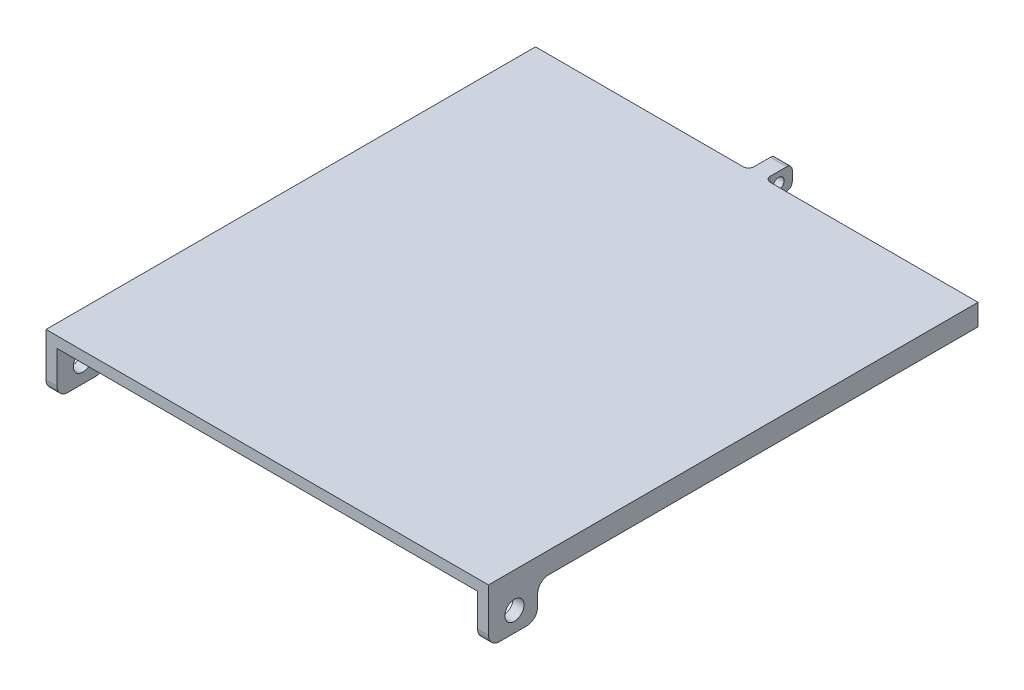
ISO-10303-21;
HEADER;
FILE_DESCRIPTION(('STEP AP214'),'2;1');
FILE_NAME('part.step','',(''),(''),'','','');
FILE_SCHEMA(('AUTOMOTIVE_DESIGN { 1 0 10303 214 1 1 1 1 }'));
ENDSEC;
DATA;
#1=APPLICATION_CONTEXT('core data for automotive mechanical design processes');
#2=APPLICATION_PROTOCOL_DEFINITION('international standard','automotive_design',2000,#1);
#3=PRODUCT_CONTEXT('',#1,'mechanical');
#4=PRODUCT('Part','Part','',(#3));
#5=PRODUCT_RELATED_PRODUCT_CATEGORY('part','',(#4));
#6=PRODUCT_DEFINITION_FORMATION('','',#4);
#7=PRODUCT_DEFINITION_CONTEXT('part definition',#1,'design');
#8=PRODUCT_DEFINITION('design','',#6,#7);
#9=PRODUCT_DEFINITION_SHAPE('','',#8);
#10=(LENGTH_UNIT() NAMED_UNIT(*) SI_UNIT(.MILLI.,.METRE.));
#11=(NAMED_UNIT(*) PLANE_ANGLE_UNIT() SI_UNIT($,.RADIAN.));
#12=(NAMED_UNIT(*) SI_UNIT($,.STERADIAN.) SOLID_ANGLE_UNIT());
#13=UNCERTAINTY_MEASURE_WITH_UNIT(LENGTH_MEASURE(1.E-05),#10,'distance_accuracy_value','');
#14=(GEOMETRIC_REPRESENTATION_CONTEXT(3) GLOBAL_UNCERTAINTY_ASSIGNED_CONTEXT((#13)) GLOBAL_UNIT_ASSIGNED_CONTEXT((#10,
#11,#12)) REPRESENTATION_CONTEXT('',''));
#15=CARTESIAN_POINT('',(0.,0.,0.));
#16=DIRECTION('',(0.,0.,1.));
#17=DIRECTION('',(1.,0.,0.));
#18=AXIS2_PLACEMENT_3D('',#15,#16,#17);
#19=CARTESIAN_POINT('',(32.8584578602391,8.,-94.0886048384759));
#20=DIRECTION('',(0.,0.,1.));
#21=DIRECTION('',(1.,0.,0.));
#22=AXIS2_PLACEMENT_3D('',#19,#20,#21);
#23=PLANE('',#22);
#24=DIRECTION('',(-1.,0.,0.));
#25=VECTOR('',#24,1.);
#26=CARTESIAN_POINT('',(-48.1415421397609,10.,-94.0886048384759));
#27=LINE('',#26,#25);
#28=CARTESIAN_POINT('',(-10.1415421397609,10.,-94.0886048384759));
#29=VERTEX_POINT('',#28);
#30=CARTESIAN_POINT('',(-48.1415421397609,10.,-94.0886048384759));
#31=VERTEX_POINT('',#30);
#32=EDGE_CURVE('E356',#29,#31,#27,.T.);
#33=ORIENTED_EDGE('',*,*,#32,.F.);
#34=DIRECTION('',(0.,1.,0.));
#35=VECTOR('',#34,1.);
#36=CARTESIAN_POINT('',(-10.1415421397609,8.,-94.0886048384759));
#37=LINE('',#36,#35);
#38=CARTESIAN_POINT('',(-10.1415421397609,6.1,-94.0886048384759));
#39=VERTEX_POINT('',#38);
#40=EDGE_CURVE('E53',#29,#39,#37,.F.);
#41=ORIENTED_EDGE('',*,*,#40,.T.);
#42=DIRECTION('',(-1.,0.,0.));
#43=VECTOR('',#42,1.);
#44=CARTESIAN_POINT('',(32.8584578602391,6.1,-94.0886048384759));
#45=LINE('',#44,#43);
#46=CARTESIAN_POINT('',(-48.1415421397609,6.1,-94.0886048384759));
#47=VERTEX_POINT('',#46);
#48=EDGE_CURVE('E317',#39,#47,#45,.T.);
#49=ORIENTED_EDGE('',*,*,#48,.T.);
#50=DIRECTION('',(0.,-1.,0.));
#51=VECTOR('',#50,1.);
#52=CARTESIAN_POINT('',(-48.1415421397609,8.,-94.0886048384759));
#53=LINE('',#52,#51);
#54=EDGE_CURVE('E404',#31,#47,#53,.T.);
#55=ORIENTED_EDGE('',*,*,#54,.F.);
#56=EDGE_LOOP('',(#33,#41,#49,#55));
#57=FACE_BOUND('',#56,.T.);
#58=ADVANCED_FACE('F32',(#57),#23,.F.);
#59=CARTESIAN_POINT('',(0.,8.,0.));
#60=DIRECTION('',(0.,1.,0.));
#61=DIRECTION('',(0.,0.,1.));
#62=AXIS2_PLACEMENT_3D('',#59,#60,#61);
#63=PLANE('',#62);
#64=DIRECTION('',(1.,0.,0.));
#65=VECTOR('',#64,1.);
#66=CARTESIAN_POINT('',(-48.1415421397609,8.,-4.48860483847592));
#67=LINE('',#66,#65);
#68=CARTESIAN_POINT('',(-46.1415421397609,8.,-4.48860483847592));
#69=VERTEX_POINT('',#68);
#70=CARTESIAN_POINT('',(30.8584578602391,8.,-4.48860483847592));
#71=VERTEX_POINT('',#70);
#72=EDGE_CURVE('E347',#69,#71,#67,.T.);
#73=ORIENTED_EDGE('',*,*,#72,.F.);
#74=DIRECTION('',(0.,0.,-1.));
#75=VECTOR('',#74,1.);
#76=CARTESIAN_POINT('',(-46.1415421397609,8.,-4.48860483847592));
#77=LINE('',#76,#75);
#78=CARTESIAN_POINT('',(-46.1415421397609,8.,-92.0886048384759));
#79=VERTEX_POINT('',#78);
#80=EDGE_CURVE('E363',#69,#79,#77,.T.);
#81=ORIENTED_EDGE('',*,*,#80,.T.);
#82=DIRECTION('',(1.,0.,0.));
#83=VECTOR('',#82,1.);
#84=CARTESIAN_POINT('',(-46.1415421397609,8.,-92.0886048384759));
#85=LINE('',#84,#83);
#86=CARTESIAN_POINT('',(30.8584578602391,8.,-92.0886048384759));
#87=VERTEX_POINT('',#86);
#88=EDGE_CURVE('E366',#79,#87,#85,.T.);
#89=ORIENTED_EDGE('',*,*,#88,.T.);
#90=DIRECTION('',(0.,0.,1.));
#91=VECTOR('',#90,1.);
#92=CARTESIAN_POINT('',(30.8584578602391,8.,-92.0886048384759));
#93=LINE('',#92,#91);
#94=EDGE_CURVE('E370',#87,#71,#93,.T.);
#95=ORIENTED_EDGE('',*,*,#94,.T.);
#96=EDGE_LOOP('',(#73,#81,#89,#95));
#97=FACE_BOUND('',#96,.T.);
#98=DIRECTION('',(0.,0.,-1.));
#99=VECTOR('',#98,1.);
#100=CARTESIAN_POINT('',(-42.0415421397609,8.,-13.005302831254));
#101=LINE('',#100,#99);
#102=CARTESIAN_POINT('',(-42.0415421397609,8.,-9.80530283125397));
#103=VERTEX_POINT('',#102);
#104=CARTESIAN_POINT('',(-42.0415421397609,8.,-13.005302831254));
#105=VERTEX_POINT('',#104);
#106=EDGE_CURVE('E296',#103,#105,#101,.T.);
#107=ORIENTED_EDGE('',*,*,#106,.F.);
#108=DIRECTION('',(-1.,0.,0.));
#109=VECTOR('',#108,1.);
#110=CARTESIAN_POINT('',(26.7584578602391,8.,-9.80530283125396));
#111=LINE('',#110,#109);
#112=CARTESIAN_POINT('',(26.7584578602391,8.,-9.80530283125396));
#113=VERTEX_POINT('',#112);
#114=EDGE_CURVE('E407',#103,#113,#111,.F.);
#115=ORIENTED_EDGE('',*,*,#114,.T.);
#116=DIRECTION('',(0.,0.,1.));
#117=VECTOR('',#116,1.);
#118=CARTESIAN_POINT('',(26.7584578602391,8.,-13.005302831254));
#119=LINE('',#118,#117);
#120=CARTESIAN_POINT('',(26.7584578602391,8.,-13.005302831254));
#121=VERTEX_POINT('',#120);
#122=EDGE_CURVE('E279',#121,#113,#119,.T.);
#123=ORIENTED_EDGE('',*,*,#122,.F.);
#124=DIRECTION('',(1.,0.,0.));
#125=VECTOR('',#124,1.);
#126=CARTESIAN_POINT('',(26.7584578602391,8.,-13.005302831254));
#127=LINE('',#126,#125);
#128=EDGE_CURVE('E287',#105,#121,#127,.T.);
#129=ORIENTED_EDGE('',*,*,#128,.F.);
#130=EDGE_LOOP('',(#107,#115,#123,#129));
#131=FACE_BOUND('',#130,.T.);
#132=ADVANCED_FACE('F510',(#97,#131),#63,.F.);
#133=CARTESIAN_POINT('',(0.,0.,0.));
#134=DIRECTION('',(0.,1.,0.));
#135=DIRECTION('',(0.,0.,1.));
#136=AXIS2_PLACEMENT_3D('',#133,#134,#135);
#137=PLANE('',#136);
#138=DIRECTION('',(0.,0.,-1.));
#139=VECTOR('',#138,1.);
#140=CARTESIAN_POINT('',(-46.1415421397609,0.,-13.4886048384759));
#141=LINE('',#140,#139);
#142=CARTESIAN_POINT('',(-46.1415421397609,0.,-6.48860483847592));
#143=VERTEX_POINT('',#142);
#144=CARTESIAN_POINT('',(-46.1415421397609,0.,-11.488604838476));
#145=VERTEX_POINT('',#144);
#146=EDGE_CURVE('E376',#143,#145,#141,.T.);
#147=ORIENTED_EDGE('',*,*,#146,.F.);
#148=DIRECTION('',(1.,0.,0.));
#149=VECTOR('',#148,1.);
#150=CARTESIAN_POINT('',(0.,0.,-6.48860483847592));
#151=LINE('',#150,#149);
#152=CARTESIAN_POINT('',(-48.1415421397609,0.,-6.48860483847592));
#153=VERTEX_POINT('',#152);
#154=EDGE_CURVE('E423',#143,#153,#151,.F.);
#155=ORIENTED_EDGE('',*,*,#154,.T.);
#156=DIRECTION('',(0.,0.,1.));
#157=VECTOR('',#156,1.);
#158=CARTESIAN_POINT('',(-48.1415421397609,0.,-94.0886048384759));
#159=LINE('',#158,#157);
#160=CARTESIAN_POINT('',(-48.1415421397609,0.,-11.488604838476));
#161=VERTEX_POINT('',#160);
#162=EDGE_CURVE('E360',#161,#153,#159,.T.);
#163=ORIENTED_EDGE('',*,*,#162,.F.);
#164=DIRECTION('',(1.,0.,0.));
#165=VECTOR('',#164,1.);
#166=CARTESIAN_POINT('',(0.,0.,-11.488604838476));
#167=LINE('',#166,#165);
#168=EDGE_CURVE('E420',#161,#145,#167,.T.);
#169=ORIENTED_EDGE('',*,*,#168,.T.);
#170=EDGE_LOOP('',(#147,#155,#163,#169));
#171=FACE_BOUND('',#170,.T.);
#172=ADVANCED_FACE('F515',(#171),#137,.F.);
#173=CARTESIAN_POINT('',(32.8584578602391,6.1,-94.0886048384759));
#174=VERTEX_POINT('',#173);
#175=CARTESIAN_POINT('',(-5.14154213976092,6.1,-94.0886048384759));
#176=VERTEX_POINT('',#175);
#177=EDGE_CURVE('E318',#174,#176,#45,.T.);
#178=ORIENTED_EDGE('',*,*,#177,.T.);
#179=DIRECTION('',(0.,1.,0.));
#180=VECTOR('',#179,1.);
#181=CARTESIAN_POINT('',(-5.14154213976092,10.,-94.0886048384759));
#182=LINE('',#181,#180);
#183=CARTESIAN_POINT('',(-5.14154213976092,10.,-94.0886048384759));
#184=VERTEX_POINT('',#183);
#185=EDGE_CURVE('E469',#176,#184,#182,.T.);
#186=ORIENTED_EDGE('',*,*,#185,.T.);
#187=CARTESIAN_POINT('',(32.8584578602391,10.,-94.0886048384759));
#188=VERTEX_POINT('',#187);
#189=EDGE_CURVE('E357',#188,#184,#27,.T.);
#190=ORIENTED_EDGE('',*,*,#189,.F.);
#191=DIRECTION('',(0.,-1.,0.));
#192=VECTOR('',#191,1.);
#193=CARTESIAN_POINT('',(32.8584578602391,8.,-94.0886048384759));
#194=LINE('',#193,#192);
#195=EDGE_CURVE('E373',#188,#174,#194,.T.);
#196=ORIENTED_EDGE('',*,*,#195,.T.);
#197=EDGE_LOOP('',(#178,#186,#190,#196));
#198=FACE_BOUND('',#197,.T.);
#199=ADVANCED_FACE('F490',(#198),#23,.F.);
#200=CARTESIAN_POINT('',(-48.1415421397609,8.,-94.0886048384759));
#201=DIRECTION('',(1.,0.,0.));
#202=DIRECTION('',(0.,0.,-1.));
#203=AXIS2_PLACEMENT_3D('',#200,#201,#202);
#204=PLANE('',#203);
#205=CARTESIAN_POINT('',(-48.1415421397609,3.6,-9.23860483847593));
#206=DIRECTION('',(1.,0.,0.));
#207=DIRECTION('',(0.,0.,-1.));
#208=AXIS2_PLACEMENT_3D('',#205,#206,#207);
#209=CIRCLE('',#208,1.75);
#210=CARTESIAN_POINT('',(-48.1415421397609,3.6,-10.9886048384759));
#211=VERTEX_POINT('',#210);
#212=EDGE_CURVE('E336',#211,#211,#209,.T.);
#213=ORIENTED_EDGE('',*,*,#212,.T.);
#214=EDGE_LOOP('',(#213));
#215=FACE_BOUND('',#214,.T.);
#216=ORIENTED_EDGE('',*,*,#162,.T.);
#217=CARTESIAN_POINT('',(-48.1415421397609,2.,-6.48860483847592));
#218=DIRECTION('',(1.,0.,0.));
#219=DIRECTION('',(0.,0.,-1.));
#220=AXIS2_PLACEMENT_3D('',#217,#218,#219);
#221=CIRCLE('',#220,2.);
#222=CARTESIAN_POINT('',(-48.1415421397609,2.,-4.48860483847592));
#223=VERTEX_POINT('',#222);
#224=EDGE_CURVE('E427',#153,#223,#221,.F.);
#225=ORIENTED_EDGE('',*,*,#224,.T.);
#226=DIRECTION('',(0.,-1.,0.));
#227=VECTOR('',#226,1.);
#228=CARTESIAN_POINT('',(-48.1415421397609,8.,-4.48860483847592));
#229=LINE('',#228,#227);
#230=CARTESIAN_POINT('',(-48.1415421397609,10.,-4.48860483847592));
#231=VERTEX_POINT('',#230);
#232=EDGE_CURVE('E401',#231,#223,#229,.T.);
#233=ORIENTED_EDGE('',*,*,#232,.F.);
#234=DIRECTION('',(0.,0.,1.));
#235=VECTOR('',#234,1.);
#236=CARTESIAN_POINT('',(-48.1415421397609,10.,-94.0886048384759));
#237=LINE('',#236,#235);
#238=EDGE_CURVE('E348',#31,#231,#237,.T.);
#239=ORIENTED_EDGE('',*,*,#238,.F.);
#240=ORIENTED_EDGE('',*,*,#54,.T.);
#241=DIRECTION('',(0.,0.,-1.));
#242=VECTOR('',#241,1.);
#243=CARTESIAN_POINT('',(-48.1415421397609,6.1,-94.0886048384759));
#244=LINE('',#243,#242);
#245=CARTESIAN_POINT('',(-48.1415421397609,6.1,-15.488604838476));
#246=VERTEX_POINT('',#245);
#247=EDGE_CURVE('E309',#246,#47,#244,.T.);
#248=ORIENTED_EDGE('',*,*,#247,.F.);
#249=CARTESIAN_POINT('',(-48.1415421397609,4.1,-15.488604838476));
#250=DIRECTION('',(1.,0.,0.));
#251=DIRECTION('',(0.,0.,-1.));
#252=AXIS2_PLACEMENT_3D('',#249,#250,#251);
#253=CIRCLE('',#252,2.);
#254=CARTESIAN_POINT('',(-48.1415421397609,4.1,-13.488604838476));
#255=VERTEX_POINT('',#254);
#256=EDGE_CURVE('E461',#246,#255,#253,.T.);
#257=ORIENTED_EDGE('',*,*,#256,.T.);
#258=DIRECTION('',(0.,1.,0.));
#259=VECTOR('',#258,1.);
#260=CARTESIAN_POINT('',(-48.1415421397609,6.1,-13.488604838476));
#261=LINE('',#260,#259);
#262=CARTESIAN_POINT('',(-48.1415421397609,2.,-13.488604838476));
#263=VERTEX_POINT('',#262);
#264=EDGE_CURVE('E306',#263,#255,#261,.T.);
#265=ORIENTED_EDGE('',*,*,#264,.F.);
#266=CARTESIAN_POINT('',(-48.1415421397609,2.,-11.488604838476));
#267=DIRECTION('',(1.,0.,0.));
#268=DIRECTION('',(0.,0.,-1.));
#269=AXIS2_PLACEMENT_3D('',#266,#267,#268);
#270=CIRCLE('',#269,2.);
#271=EDGE_CURVE('E425',#263,#161,#270,.F.);
#272=ORIENTED_EDGE('',*,*,#271,.T.);
#273=EDGE_LOOP('',(#216,#225,#233,#239,#240,#248,#257,#265,#272));
#274=FACE_BOUND('',#273,.T.);
#275=ADVANCED_FACE('F521',(#215,#274),#204,.F.);
#276=CARTESIAN_POINT('',(-46.1415421397609,8.,-13.4886048384759));
#277=DIRECTION('',(-1.,0.,0.));
#278=DIRECTION('',(0.,0.,1.));
#279=AXIS2_PLACEMENT_3D('',#276,#277,#278);
#280=PLANE('',#279);
#281=CARTESIAN_POINT('',(-46.1415421397609,3.6,-9.23860483847593));
#282=DIRECTION('',(-1.,0.,0.));
#283=DIRECTION('',(0.,0.,1.));
#284=AXIS2_PLACEMENT_3D('',#281,#282,#283);
#285=CIRCLE('',#284,1.75);
#286=CARTESIAN_POINT('',(-46.1415421397609,3.6,-7.48860483847593));
#287=VERTEX_POINT('',#286);
#288=EDGE_CURVE('E344',#287,#287,#285,.T.);
#289=ORIENTED_EDGE('',*,*,#288,.T.);
#290=EDGE_LOOP('',(#289));
#291=FACE_BOUND('',#290,.T.);
#292=DIRECTION('',(0.,-1.,0.));
#293=VECTOR('',#292,1.);
#294=CARTESIAN_POINT('',(-46.1415421397609,8.,-4.48860483847592));
#295=LINE('',#294,#293);
#296=CARTESIAN_POINT('',(-46.1415421397609,2.,-4.48860483847592));
#297=VERTEX_POINT('',#296);
#298=EDGE_CURVE('E398',#69,#297,#295,.T.);
#299=ORIENTED_EDGE('',*,*,#298,.T.);
#300=CARTESIAN_POINT('',(-46.1415421397609,2.,-6.48860483847592));
#301=DIRECTION('',(-1.,0.,0.));
#302=DIRECTION('',(0.,0.,1.));
#303=AXIS2_PLACEMENT_3D('',#300,#301,#302);
#304=CIRCLE('',#303,2.);
#305=EDGE_CURVE('E418',#297,#143,#304,.F.);
#306=ORIENTED_EDGE('',*,*,#305,.T.);
#307=ORIENTED_EDGE('',*,*,#146,.T.);
#308=CARTESIAN_POINT('',(-46.1415421397609,2.,-11.488604838476));
#309=DIRECTION('',(-1.,0.,0.));
#310=DIRECTION('',(0.,0.,1.));
#311=AXIS2_PLACEMENT_3D('',#308,#309,#310);
#312=CIRCLE('',#311,2.);
#313=CARTESIAN_POINT('',(-46.1415421397609,2.,-13.488604838476));
#314=VERTEX_POINT('',#313);
#315=EDGE_CURVE('E416',#145,#314,#312,.F.);
#316=ORIENTED_EDGE('',*,*,#315,.T.);
#317=DIRECTION('',(0.,1.,0.));
#318=VECTOR('',#317,1.);
#319=CARTESIAN_POINT('',(-46.1415421397609,8.,-13.488604838476));
#320=LINE('',#319,#318);
#321=CARTESIAN_POINT('',(-46.1415421397609,4.1,-13.488604838476));
#322=VERTEX_POINT('',#321);
#323=EDGE_CURVE('E324',#314,#322,#320,.T.);
#324=ORIENTED_EDGE('',*,*,#323,.T.);
#325=CARTESIAN_POINT('',(-46.1415421397609,4.1,-15.488604838476));
#326=DIRECTION('',(-1.,0.,0.));
#327=DIRECTION('',(0.,0.,1.));
#328=AXIS2_PLACEMENT_3D('',#325,#326,#327);
#329=CIRCLE('',#328,2.);
#330=CARTESIAN_POINT('',(-46.1415421397609,6.1,-15.488604838476));
#331=VERTEX_POINT('',#330);
#332=EDGE_CURVE('E463',#322,#331,#329,.T.);
#333=ORIENTED_EDGE('',*,*,#332,.T.);
#334=DIRECTION('',(0.,0.,-1.));
#335=VECTOR('',#334,1.);
#336=CARTESIAN_POINT('',(-46.1415421397609,6.1,-13.4886048384759));
#337=LINE('',#336,#335);
#338=CARTESIAN_POINT('',(-46.1415421397609,6.1,-92.0886048384759));
#339=VERTEX_POINT('',#338);
#340=EDGE_CURVE('E333',#331,#339,#337,.T.);
#341=ORIENTED_EDGE('',*,*,#340,.T.);
#342=DIRECTION('',(0.,-1.,0.));
#343=VECTOR('',#342,1.);
#344=CARTESIAN_POINT('',(-46.1415421397609,8.,-92.0886048384759));
#345=LINE('',#344,#343);
#346=EDGE_CURVE('E395',#79,#339,#345,.T.);
#347=ORIENTED_EDGE('',*,*,#346,.F.);
#348=ORIENTED_EDGE('',*,*,#80,.F.);
#349=EDGE_LOOP('',(#299,#306,#307,#316,#324,#333,#341,#347,#348));
#350=FACE_BOUND('',#349,.T.);
#351=ADVANCED_FACE('F526',(#291,#350),#280,.F.);
#352=CARTESIAN_POINT('',(-46.1415421397609,8.,-92.0886048384759));
#353=DIRECTION('',(0.,0.,-1.));
#354=DIRECTION('',(-1.,0.,0.));
#355=AXIS2_PLACEMENT_3D('',#352,#353,#354);
#356=PLANE('',#355);
#357=ORIENTED_EDGE('',*,*,#346,.T.);
#358=DIRECTION('',(1.,0.,0.));
#359=VECTOR('',#358,1.);
#360=CARTESIAN_POINT('',(-46.1415421397609,6.1,-92.0886048384759));
#361=LINE('',#360,#359);
#362=CARTESIAN_POINT('',(30.858457860239,6.1,-92.0886048384759));
#363=VERTEX_POINT('',#362);
#364=EDGE_CURVE('E330',#339,#363,#361,.T.);
#365=ORIENTED_EDGE('',*,*,#364,.T.);
#366=DIRECTION('',(0.,-1.,0.));
#367=VECTOR('',#366,1.);
#368=CARTESIAN_POINT('',(30.8584578602391,8.,-92.0886048384759));
#369=LINE('',#368,#367);
#370=EDGE_CURVE('E392',#87,#363,#369,.T.);
#371=ORIENTED_EDGE('',*,*,#370,.F.);
#372=ORIENTED_EDGE('',*,*,#88,.F.);
#373=EDGE_LOOP('',(#357,#365,#371,#372));
#374=FACE_BOUND('',#373,.T.);
#375=ADVANCED_FACE('F565',(#374),#356,.F.);
#376=CARTESIAN_POINT('',(30.8584578602391,8.,-13.4886048384759));
#377=DIRECTION('',(1.,0.,0.));
#378=DIRECTION('',(0.,0.,-1.));
#379=AXIS2_PLACEMENT_3D('',#376,#377,#378);
#380=PLANE('',#379);
#381=CARTESIAN_POINT('',(30.8584578602391,3.6,-9.23860483847592));
#382=DIRECTION('',(1.,0.,0.));
#383=DIRECTION('',(0.,0.,-1.));
#384=AXIS2_PLACEMENT_3D('',#381,#382,#383);
#385=CIRCLE('',#384,1.75);
#386=CARTESIAN_POINT('',(30.8584578602391,3.6,-10.9886048384759));
#387=VERTEX_POINT('',#386);
#388=EDGE_CURVE('E339',#387,#387,#385,.T.);
#389=ORIENTED_EDGE('',*,*,#388,.T.);
#390=EDGE_LOOP('',(#389));
#391=FACE_BOUND('',#390,.T.);
#392=DIRECTION('',(0.,0.,1.));
#393=VECTOR('',#392,1.);
#394=CARTESIAN_POINT('',(30.8584578602391,0.,-13.4886048384759));
#395=LINE('',#394,#393);
#396=CARTESIAN_POINT('',(30.8584578602391,0.,-11.488604838476));
#397=VERTEX_POINT('',#396);
#398=CARTESIAN_POINT('',(30.8584578602391,0.,-6.48860483847592));
#399=VERTEX_POINT('',#398);
#400=EDGE_CURVE('E379',#397,#399,#395,.T.);
#401=ORIENTED_EDGE('',*,*,#400,.T.);
#402=CARTESIAN_POINT('',(30.8584578602391,2.,-6.48860483847592));
#403=DIRECTION('',(1.,0.,0.));
#404=DIRECTION('',(0.,0.,-1.));
#405=AXIS2_PLACEMENT_3D('',#402,#403,#404);
#406=CIRCLE('',#405,2.);
#407=CARTESIAN_POINT('',(30.8584578602391,2.,-4.48860483847592));
#408=VERTEX_POINT('',#407);
#409=EDGE_CURVE('E454',#399,#408,#406,.F.);
#410=ORIENTED_EDGE('',*,*,#409,.T.);
#411=DIRECTION('',(0.,-1.,0.));
#412=VECTOR('',#411,1.);
#413=CARTESIAN_POINT('',(30.8584578602391,8.,-4.48860483847592));
#414=LINE('',#413,#412);
#415=EDGE_CURVE('E389',#71,#408,#414,.T.);
#416=ORIENTED_EDGE('',*,*,#415,.F.);
#417=ORIENTED_EDGE('',*,*,#94,.F.);
#418=ORIENTED_EDGE('',*,*,#370,.T.);
#419=DIRECTION('',(0.,0.,1.));
#420=VECTOR('',#419,1.);
#421=CARTESIAN_POINT('',(30.8584578602391,6.1,-13.4886048384759));
#422=LINE('',#421,#420);
#423=CARTESIAN_POINT('',(30.8584578602391,6.1,-15.488604838476));
#424=VERTEX_POINT('',#423);
#425=EDGE_CURVE('E327',#363,#424,#422,.T.);
#426=ORIENTED_EDGE('',*,*,#425,.T.);
#427=CARTESIAN_POINT('',(30.8584578602391,4.1,-15.488604838476));
#428=DIRECTION('',(1.,0.,0.));
#429=DIRECTION('',(0.,0.,-1.));
#430=AXIS2_PLACEMENT_3D('',#427,#428,#429);
#431=CIRCLE('',#430,2.);
#432=CARTESIAN_POINT('',(30.8584578602391,4.1,-13.488604838476));
#433=VERTEX_POINT('',#432);
#434=EDGE_CURVE('E465',#424,#433,#431,.T.);
#435=ORIENTED_EDGE('',*,*,#434,.T.);
#436=DIRECTION('',(0.,-1.,0.));
#437=VECTOR('',#436,1.);
#438=CARTESIAN_POINT('',(30.8584578602391,8.,-13.488604838476));
#439=LINE('',#438,#437);
#440=CARTESIAN_POINT('',(30.8584578602391,2.,-13.488604838476));
#441=VERTEX_POINT('',#440);
#442=EDGE_CURVE('E321',#433,#441,#439,.T.);
#443=ORIENTED_EDGE('',*,*,#442,.T.);
#444=CARTESIAN_POINT('',(30.8584578602391,2.,-11.488604838476));
#445=DIRECTION('',(1.,0.,0.));
#446=DIRECTION('',(0.,0.,-1.));
#447=AXIS2_PLACEMENT_3D('',#444,#445,#446);
#448=CIRCLE('',#447,2.);
#449=EDGE_CURVE('E452',#441,#397,#448,.F.);
#450=ORIENTED_EDGE('',*,*,#449,.T.);
#451=EDGE_LOOP('',(#401,#410,#416,#417,#418,#426,#435,#443,#450));
#452=FACE_BOUND('',#451,.T.);
#453=ADVANCED_FACE('F557',(#391,#452),#380,.F.);
#454=CARTESIAN_POINT('',(30.8584578602391,8.,-4.48860483847592));
#455=DIRECTION('',(0.,0.,-1.));
#456=DIRECTION('',(-1.,0.,0.));
#457=AXIS2_PLACEMENT_3D('',#454,#455,#456);
#458=PLANE('',#457);
#459=ORIENTED_EDGE('',*,*,#232,.T.);
#460=DIRECTION('',(1.,0.,0.));
#461=VECTOR('',#460,1.);
#462=CARTESIAN_POINT('',(30.8584578602391,2.,-4.48860483847592));
#463=LINE('',#462,#461);
#464=EDGE_CURVE('E413',#223,#297,#463,.T.);
#465=ORIENTED_EDGE('',*,*,#464,.T.);
#466=ORIENTED_EDGE('',*,*,#298,.F.);
#467=ORIENTED_EDGE('',*,*,#72,.T.);
#468=ORIENTED_EDGE('',*,*,#415,.T.);
#469=DIRECTION('',(1.,0.,0.));
#470=VECTOR('',#469,1.);
#471=CARTESIAN_POINT('',(30.8584578602391,2.,-4.48860483847592));
#472=LINE('',#471,#470);
#473=CARTESIAN_POINT('',(32.8584578602391,2.,-4.48860483847592));
#474=VERTEX_POINT('',#473);
#475=EDGE_CURVE('E410',#408,#474,#472,.T.);
#476=ORIENTED_EDGE('',*,*,#475,.T.);
#477=DIRECTION('',(0.,-1.,0.));
#478=VECTOR('',#477,1.);
#479=CARTESIAN_POINT('',(32.8584578602391,8.,-4.48860483847592));
#480=LINE('',#479,#478);
#481=CARTESIAN_POINT('',(32.8584578602391,10.,-4.48860483847592));
#482=VERTEX_POINT('',#481);
#483=EDGE_CURVE('E386',#482,#474,#480,.T.);
#484=ORIENTED_EDGE('',*,*,#483,.F.);
#485=DIRECTION('',(1.,0.,0.));
#486=VECTOR('',#485,1.);
#487=CARTESIAN_POINT('',(-48.1415421397609,10.,-4.48860483847592));
#488=LINE('',#487,#486);
#489=EDGE_CURVE('E350',#231,#482,#488,.T.);
#490=ORIENTED_EDGE('',*,*,#489,.F.);
#491=EDGE_LOOP('',(#459,#465,#466,#467,#468,#476,#484,#490));
#492=FACE_BOUND('',#491,.T.);
#493=ADVANCED_FACE('F544',(#492),#458,.F.);
#494=CARTESIAN_POINT('',(32.8584578602391,8.,-4.48860483847592));
#495=DIRECTION('',(-1.,0.,0.));
#496=DIRECTION('',(0.,0.,1.));
#497=AXIS2_PLACEMENT_3D('',#494,#495,#496);
#498=PLANE('',#497);
#499=CARTESIAN_POINT('',(32.8584578602391,3.6,-9.23860483847592));
#500=DIRECTION('',(1.,0.,0.));
#501=DIRECTION('',(0.,0.,-1.));
#502=AXIS2_PLACEMENT_3D('',#499,#500,#501);
#503=CIRCLE('',#502,1.75);
#504=CARTESIAN_POINT('',(32.8584578602391,3.6,-10.9886048384759));
#505=VERTEX_POINT('',#504);
#506=EDGE_CURVE('E335',#505,#505,#503,.T.);
#507=ORIENTED_EDGE('',*,*,#506,.F.);
#508=EDGE_LOOP('',(#507));
#509=FACE_BOUND('',#508,.T.);
#510=ORIENTED_EDGE('',*,*,#483,.T.);
#511=CARTESIAN_POINT('',(32.8584578602391,2.,-6.48860483847592));
#512=DIRECTION('',(-1.,0.,0.));
#513=DIRECTION('',(0.,0.,1.));
#514=AXIS2_PLACEMENT_3D('',#511,#512,#513);
#515=CIRCLE('',#514,2.);
#516=CARTESIAN_POINT('',(32.8584578602391,0.,-6.48860483847592));
#517=VERTEX_POINT('',#516);
#518=EDGE_CURVE('E446',#474,#517,#515,.F.);
#519=ORIENTED_EDGE('',*,*,#518,.T.);
#520=DIRECTION('',(0.,0.,-1.));
#521=VECTOR('',#520,1.);
#522=CARTESIAN_POINT('',(32.8584578602391,0.,-4.48860483847592));
#523=LINE('',#522,#521);
#524=CARTESIAN_POINT('',(32.8584578602391,0.,-11.488604838476));
#525=VERTEX_POINT('',#524);
#526=EDGE_CURVE('E367',#517,#525,#523,.T.);
#527=ORIENTED_EDGE('',*,*,#526,.T.);
#528=CARTESIAN_POINT('',(32.8584578602391,2.,-11.488604838476));
#529=DIRECTION('',(-1.,0.,0.));
#530=DIRECTION('',(0.,0.,1.));
#531=AXIS2_PLACEMENT_3D('',#528,#529,#530);
#532=CIRCLE('',#531,2.);
#533=CARTESIAN_POINT('',(32.8584578602391,2.,-13.488604838476));
#534=VERTEX_POINT('',#533);
#535=EDGE_CURVE('E444',#525,#534,#532,.F.);
#536=ORIENTED_EDGE('',*,*,#535,.T.);
#537=DIRECTION('',(0.,1.,0.));
#538=VECTOR('',#537,1.);
#539=CARTESIAN_POINT('',(32.8584578602391,6.1,-13.488604838476));
#540=LINE('',#539,#538);
#541=CARTESIAN_POINT('',(32.8584578602391,4.1,-13.488604838476));
#542=VERTEX_POINT('',#541);
#543=EDGE_CURVE('E312',#534,#542,#540,.T.);
#544=ORIENTED_EDGE('',*,*,#543,.T.);
#545=CARTESIAN_POINT('',(32.8584578602391,4.1,-15.488604838476));
#546=DIRECTION('',(-1.,0.,0.));
#547=DIRECTION('',(0.,0.,1.));
#548=AXIS2_PLACEMENT_3D('',#545,#546,#547);
#549=CIRCLE('',#548,2.);
#550=CARTESIAN_POINT('',(32.8584578602391,6.1,-15.488604838476));
#551=VERTEX_POINT('',#550);
#552=EDGE_CURVE('E467',#542,#551,#549,.T.);
#553=ORIENTED_EDGE('',*,*,#552,.T.);
#554=DIRECTION('',(0.,0.,-1.));
#555=VECTOR('',#554,1.);
#556=CARTESIAN_POINT('',(32.8584578602391,6.1,-94.0886048384759));
#557=LINE('',#556,#555);
#558=EDGE_CURVE('E315',#551,#174,#557,.T.);
#559=ORIENTED_EDGE('',*,*,#558,.T.);
#560=ORIENTED_EDGE('',*,*,#195,.F.);
#561=DIRECTION('',(0.,0.,-1.));
#562=VECTOR('',#561,1.);
#563=CARTESIAN_POINT('',(32.8584578602391,10.,-94.0886048384759));
#564=LINE('',#563,#562);
#565=EDGE_CURVE('E353',#482,#188,#564,.T.);
#566=ORIENTED_EDGE('',*,*,#565,.F.);
#567=EDGE_LOOP('',(#510,#519,#527,#536,#544,#553,#559,#560,#566));
#568=FACE_BOUND('',#567,.T.);
#569=ADVANCED_FACE('F536',(#509,#568),#498,.F.);
#570=ORIENTED_EDGE('',*,*,#526,.F.);
#571=DIRECTION('',(1.,0.,0.));
#572=VECTOR('',#571,1.);
#573=CARTESIAN_POINT('',(0.,0.,-6.48860483847592));
#574=LINE('',#573,#572);
#575=EDGE_CURVE('E450',#517,#399,#574,.F.);
#576=ORIENTED_EDGE('',*,*,#575,.T.);
#577=ORIENTED_EDGE('',*,*,#400,.F.);
#578=DIRECTION('',(-1.,0.,0.));
#579=VECTOR('',#578,1.);
#580=CARTESIAN_POINT('',(0.,0.,-11.488604838476));
#581=LINE('',#580,#579);
#582=EDGE_CURVE('E448',#397,#525,#581,.F.);
#583=ORIENTED_EDGE('',*,*,#582,.T.);
#584=EDGE_LOOP('',(#570,#576,#577,#583));
#585=FACE_BOUND('',#584,.T.);
#586=ADVANCED_FACE('F530',(#585),#137,.F.);
#587=CARTESIAN_POINT('',(0.,10.,0.));
#588=DIRECTION('',(0.,1.,0.));
#589=DIRECTION('',(0.,0.,1.));
#590=AXIS2_PLACEMENT_3D('',#587,#588,#589);
#591=PLANE('',#590);
#592=ORIENTED_EDGE('',*,*,#238,.T.);
#593=ORIENTED_EDGE('',*,*,#489,.T.);
#594=ORIENTED_EDGE('',*,*,#565,.T.);
#595=ORIENTED_EDGE('',*,*,#189,.T.);
#596=CARTESIAN_POINT('',(-5.14154213976092,10.,-95.0886048384759));
#597=DIRECTION('',(0.,1.,0.));
#598=DIRECTION('',(0.,0.,1.));
#599=AXIS2_PLACEMENT_3D('',#596,#597,#598);
#600=CIRCLE('',#599,1.);
#601=CARTESIAN_POINT('',(-6.14154213976092,10.,-95.0886048384759));
#602=VERTEX_POINT('',#601);
#603=EDGE_CURVE('E476',#184,#602,#600,.F.);
#604=ORIENTED_EDGE('',*,*,#603,.T.);
#605=DIRECTION('',(0.,0.,-1.));
#606=VECTOR('',#605,1.);
#607=CARTESIAN_POINT('',(-6.14154213976092,10.,-94.0886048384759));
#608=LINE('',#607,#606);
#609=CARTESIAN_POINT('',(-6.14154213976092,10.,-98.0886048384759));
#610=VERTEX_POINT('',#609);
#611=EDGE_CURVE('E245',#602,#610,#608,.T.);
#612=ORIENTED_EDGE('',*,*,#611,.T.);
#613=DIRECTION('',(-1.,0.,0.));
#614=VECTOR('',#613,1.);
#615=CARTESIAN_POINT('',(-6.14154213976092,10.,-98.0886048384759));
#616=LINE('',#615,#614);
#617=CARTESIAN_POINT('',(-9.14154213976092,10.,-98.0886048384759));
#618=VERTEX_POINT('',#617);
#619=EDGE_CURVE('E241',#610,#618,#616,.T.);
#620=ORIENTED_EDGE('',*,*,#619,.T.);
#621=DIRECTION('',(0.,0.,-1.));
#622=VECTOR('',#621,1.);
#623=CARTESIAN_POINT('',(-9.14154213976092,10.,-94.0886048384759));
#624=LINE('',#623,#622);
#625=CARTESIAN_POINT('',(-9.14154213976092,10.,-95.0886048384759));
#626=VERTEX_POINT('',#625);
#627=EDGE_CURVE('E227',#626,#618,#624,.T.);
#628=ORIENTED_EDGE('',*,*,#627,.F.);
#629=CARTESIAN_POINT('',(-10.1415421397609,10.,-95.0886048384759));
#630=DIRECTION('',(0.,1.,0.));
#631=DIRECTION('',(0.,0.,1.));
#632=AXIS2_PLACEMENT_3D('',#629,#630,#631);
#633=CIRCLE('',#632,1.);
#634=EDGE_CURVE('E40',#626,#29,#633,.F.);
#635=ORIENTED_EDGE('',*,*,#634,.T.);
#636=ORIENTED_EDGE('',*,*,#32,.T.);
#637=EDGE_LOOP('',(#592,#593,#594,#595,#604,#612,#620,#628,#635,#636));
#638=FACE_BOUND('',#637,.T.);
#639=ADVANCED_FACE('F243',(#638),#591,.T.);
#640=CARTESIAN_POINT('',(-48.1415421397609,3.6,-9.23860483847593));
#641=DIRECTION('',(1.,0.,0.));
#642=DIRECTION('',(0.,0.,-1.));
#643=AXIS2_PLACEMENT_3D('',#640,#641,#642);
#644=CYLINDRICAL_SURFACE('',#643,1.75);
#645=ORIENTED_EDGE('',*,*,#506,.T.);
#646=EDGE_LOOP('',(#645));
#647=FACE_BOUND('',#646,.T.);
#648=ORIENTED_EDGE('',*,*,#388,.F.);
#649=EDGE_LOOP('',(#648));
#650=FACE_BOUND('',#649,.T.);
#651=ADVANCED_FACE('F542',(#647,#650),#644,.F.);
#652=ORIENTED_EDGE('',*,*,#212,.F.);
#653=EDGE_LOOP('',(#652));
#654=FACE_BOUND('',#653,.T.);
#655=ORIENTED_EDGE('',*,*,#288,.F.);
#656=EDGE_LOOP('',(#655));
#657=FACE_BOUND('',#656,.T.);
#658=ADVANCED_FACE('F651',(#654,#657),#644,.F.);
#659=CARTESIAN_POINT('',(32.8584578602391,6.1,-94.0886048384759));
#660=DIRECTION('',(0.,1.,0.));
#661=DIRECTION('',(0.,0.,1.));
#662=AXIS2_PLACEMENT_3D('',#659,#660,#661);
#663=PLANE('',#662);
#664=ORIENTED_EDGE('',*,*,#340,.F.);
#665=DIRECTION('',(-1.,0.,0.));
#666=VECTOR('',#665,1.);
#667=CARTESIAN_POINT('',(-48.1415421397609,6.1,-15.488604838476));
#668=LINE('',#667,#666);
#669=EDGE_CURVE('E436',#331,#246,#668,.T.);
#670=ORIENTED_EDGE('',*,*,#669,.T.);
#671=ORIENTED_EDGE('',*,*,#247,.T.);
#672=ORIENTED_EDGE('',*,*,#48,.F.);
#673=CARTESIAN_POINT('',(-10.1415421397609,6.1,-95.0886048384759));
#674=DIRECTION('',(0.,1.,0.));
#675=DIRECTION('',(0.,0.,1.));
#676=AXIS2_PLACEMENT_3D('',#673,#674,#675);
#677=CIRCLE('',#676,1.);
#678=CARTESIAN_POINT('',(-9.14154213976092,6.1,-95.0886048384759));
#679=VERTEX_POINT('',#678);
#680=EDGE_CURVE('E11',#39,#679,#677,.T.);
#681=ORIENTED_EDGE('',*,*,#680,.T.);
#682=DIRECTION('',(0.,0.,1.));
#683=VECTOR('',#682,1.);
#684=CARTESIAN_POINT('',(-9.14154213976092,6.1,-94.0886048384759));
#685=LINE('',#684,#683);
#686=CARTESIAN_POINT('',(-9.14154213976092,6.1,-98.0886048384759));
#687=VERTEX_POINT('',#686);
#688=EDGE_CURVE('E261',#687,#679,#685,.T.);
#689=ORIENTED_EDGE('',*,*,#688,.F.);
#690=DIRECTION('',(-1.,0.,0.));
#691=VECTOR('',#690,1.);
#692=CARTESIAN_POINT('',(-6.14154213976092,6.1,-98.0886048384759));
#693=LINE('',#692,#691);
#694=CARTESIAN_POINT('',(-6.14154213976092,6.1,-98.0886048384759));
#695=VERTEX_POINT('',#694);
#696=EDGE_CURVE('E277',#695,#687,#693,.T.);
#697=ORIENTED_EDGE('',*,*,#696,.F.);
#698=DIRECTION('',(0.,0.,1.));
#699=VECTOR('',#698,1.);
#700=CARTESIAN_POINT('',(-6.14154213976092,6.1,-94.0886048384759));
#701=LINE('',#700,#699);
#702=CARTESIAN_POINT('',(-6.14154213976092,6.1,-95.0886048384759));
#703=VERTEX_POINT('',#702);
#704=EDGE_CURVE('E250',#695,#703,#701,.T.);
#705=ORIENTED_EDGE('',*,*,#704,.T.);
#706=CARTESIAN_POINT('',(-5.14154213976092,6.1,-95.0886048384759));
#707=DIRECTION('',(0.,1.,0.));
#708=DIRECTION('',(0.,0.,1.));
#709=AXIS2_PLACEMENT_3D('',#706,#707,#708);
#710=CIRCLE('',#709,1.);
#711=EDGE_CURVE('E478',#703,#176,#710,.T.);
#712=ORIENTED_EDGE('',*,*,#711,.T.);
#713=ORIENTED_EDGE('',*,*,#177,.F.);
#714=ORIENTED_EDGE('',*,*,#558,.F.);
#715=DIRECTION('',(-1.,0.,0.));
#716=VECTOR('',#715,1.);
#717=CARTESIAN_POINT('',(30.8584578602391,6.1,-15.488604838476));
#718=LINE('',#717,#716);
#719=EDGE_CURVE('E433',#551,#424,#718,.T.);
#720=ORIENTED_EDGE('',*,*,#719,.T.);
#721=ORIENTED_EDGE('',*,*,#425,.F.);
#722=ORIENTED_EDGE('',*,*,#364,.F.);
#723=EDGE_LOOP('',(#664,#670,#671,#672,#681,#689,#697,#705,#712,#713,#714,#720,#721,#722));
#724=FACE_BOUND('',#723,.T.);
#725=ADVANCED_FACE('F483',(#724),#663,.F.);
#726=CARTESIAN_POINT('',(32.8584578602391,6.1,-13.488604838476));
#727=DIRECTION('',(0.,0.,1.));
#728=DIRECTION('',(1.,0.,0.));
#729=AXIS2_PLACEMENT_3D('',#726,#727,#728);
#730=PLANE('',#729);
#731=ORIENTED_EDGE('',*,*,#323,.F.);
#732=DIRECTION('',(1.,0.,0.));
#733=VECTOR('',#732,1.);
#734=CARTESIAN_POINT('',(32.8584578602391,2.,-13.488604838476));
#735=LINE('',#734,#733);
#736=EDGE_CURVE('E431',#314,#263,#735,.F.);
#737=ORIENTED_EDGE('',*,*,#736,.T.);
#738=ORIENTED_EDGE('',*,*,#264,.T.);
#739=DIRECTION('',(-1.,0.,0.));
#740=VECTOR('',#739,1.);
#741=CARTESIAN_POINT('',(-46.1415421397609,4.1,-13.488604838476));
#742=LINE('',#741,#740);
#743=EDGE_CURVE('E429',#255,#322,#742,.F.);
#744=ORIENTED_EDGE('',*,*,#743,.T.);
#745=EDGE_LOOP('',(#731,#737,#738,#744));
#746=FACE_BOUND('',#745,.T.);
#747=ADVANCED_FACE('F599',(#746),#730,.F.);
#748=ORIENTED_EDGE('',*,*,#442,.F.);
#749=DIRECTION('',(-1.,0.,0.));
#750=VECTOR('',#749,1.);
#751=CARTESIAN_POINT('',(32.8584578602391,4.1,-13.488604838476));
#752=LINE('',#751,#750);
#753=EDGE_CURVE('E442',#433,#542,#752,.F.);
#754=ORIENTED_EDGE('',*,*,#753,.T.);
#755=ORIENTED_EDGE('',*,*,#543,.F.);
#756=DIRECTION('',(-1.,0.,0.));
#757=VECTOR('',#756,1.);
#758=CARTESIAN_POINT('',(32.8584578602391,2.,-13.488604838476));
#759=LINE('',#758,#757);
#760=EDGE_CURVE('E439',#534,#441,#759,.T.);
#761=ORIENTED_EDGE('',*,*,#760,.T.);
#762=EDGE_LOOP('',(#748,#754,#755,#761));
#763=FACE_BOUND('',#762,.T.);
#764=ADVANCED_FACE('F575',(#763),#730,.F.);
#765=CARTESIAN_POINT('',(26.7584578602391,6.,-13.005302831254));
#766=DIRECTION('',(-1.,0.,0.));
#767=DIRECTION('',(0.,-1.,0.));
#768=AXIS2_PLACEMENT_3D('',#765,#766,#767);
#769=PLANE('',#768);
#770=ORIENTED_EDGE('',*,*,#122,.T.);
#771=CARTESIAN_POINT('',(26.7584578602391,6.,-9.80530283125396));
#772=DIRECTION('',(-1.,0.,0.));
#773=DIRECTION('',(0.,-1.,0.));
#774=AXIS2_PLACEMENT_3D('',#771,#772,#773);
#775=CIRCLE('',#774,2.);
#776=CARTESIAN_POINT('',(26.7584578602391,6.,-11.805302831254));
#777=VERTEX_POINT('',#776);
#778=EDGE_CURVE('E459',#113,#777,#775,.T.);
#779=ORIENTED_EDGE('',*,*,#778,.T.);
#780=DIRECTION('',(0.,0.,1.));
#781=VECTOR('',#780,1.);
#782=CARTESIAN_POINT('',(26.7584578602391,6.,-13.005302831254));
#783=LINE('',#782,#781);
#784=CARTESIAN_POINT('',(26.7584578602391,6.,-13.005302831254));
#785=VERTEX_POINT('',#784);
#786=EDGE_CURVE('E283',#785,#777,#783,.T.);
#787=ORIENTED_EDGE('',*,*,#786,.F.);
#788=DIRECTION('',(0.,1.,0.));
#789=VECTOR('',#788,1.);
#790=CARTESIAN_POINT('',(26.7584578602391,6.,-13.005302831254));
#791=LINE('',#790,#789);
#792=EDGE_CURVE('E294',#785,#121,#791,.T.);
#793=ORIENTED_EDGE('',*,*,#792,.T.);
#794=EDGE_LOOP('',(#770,#779,#787,#793));
#795=FACE_BOUND('',#794,.T.);
#796=ADVANCED_FACE('F644',(#795),#769,.F.);
#797=CARTESIAN_POINT('',(-42.0415421397609,6.,-13.005302831254));
#798=DIRECTION('',(1.,0.,0.));
#799=DIRECTION('',(0.,1.,0.));
#800=AXIS2_PLACEMENT_3D('',#797,#798,#799);
#801=PLANE('',#800);
#802=ORIENTED_EDGE('',*,*,#106,.T.);
#803=DIRECTION('',(0.,1.,0.));
#804=VECTOR('',#803,1.);
#805=CARTESIAN_POINT('',(-42.0415421397609,6.,-13.005302831254));
#806=LINE('',#805,#804);
#807=CARTESIAN_POINT('',(-42.0415421397609,6.,-13.005302831254));
#808=VERTEX_POINT('',#807);
#809=EDGE_CURVE('E303',#808,#105,#806,.T.);
#810=ORIENTED_EDGE('',*,*,#809,.F.);
#811=DIRECTION('',(0.,0.,-1.));
#812=VECTOR('',#811,1.);
#813=CARTESIAN_POINT('',(-42.0415421397609,6.,-13.005302831254));
#814=LINE('',#813,#812);
#815=CARTESIAN_POINT('',(-42.0415421397609,6.,-11.805302831254));
#816=VERTEX_POINT('',#815);
#817=EDGE_CURVE('E290',#816,#808,#814,.T.);
#818=ORIENTED_EDGE('',*,*,#817,.F.);
#819=CARTESIAN_POINT('',(-42.0415421397609,6.,-9.80530283125397));
#820=DIRECTION('',(1.,0.,0.));
#821=DIRECTION('',(0.,1.,0.));
#822=AXIS2_PLACEMENT_3D('',#819,#820,#821);
#823=CIRCLE('',#822,2.);
#824=EDGE_CURVE('E456',#816,#103,#823,.T.);
#825=ORIENTED_EDGE('',*,*,#824,.T.);
#826=EDGE_LOOP('',(#802,#810,#818,#825));
#827=FACE_BOUND('',#826,.T.);
#828=ADVANCED_FACE('F640',(#827),#801,.F.);
#829=CARTESIAN_POINT('',(26.7584578602391,6.,-13.005302831254));
#830=DIRECTION('',(0.,0.,1.));
#831=DIRECTION('',(1.,0.,0.));
#832=AXIS2_PLACEMENT_3D('',#829,#830,#831);
#833=PLANE('',#832);
#834=ORIENTED_EDGE('',*,*,#128,.T.);
#835=ORIENTED_EDGE('',*,*,#792,.F.);
#836=DIRECTION('',(1.,0.,0.));
#837=VECTOR('',#836,1.);
#838=CARTESIAN_POINT('',(26.7584578602391,6.,-13.005302831254));
#839=LINE('',#838,#837);
#840=EDGE_CURVE('E292',#808,#785,#839,.T.);
#841=ORIENTED_EDGE('',*,*,#840,.F.);
#842=ORIENTED_EDGE('',*,*,#809,.T.);
#843=EDGE_LOOP('',(#834,#835,#841,#842));
#844=FACE_BOUND('',#843,.T.);
#845=ADVANCED_FACE('F636',(#844),#833,.F.);
#846=CARTESIAN_POINT('',(0.,6.,0.));
#847=DIRECTION('',(0.,-1.,0.));
#848=DIRECTION('',(0.,0.,-1.));
#849=AXIS2_PLACEMENT_3D('',#846,#847,#848);
#850=PLANE('',#849);
#851=ORIENTED_EDGE('',*,*,#786,.T.);
#852=DIRECTION('',(-1.,0.,0.));
#853=VECTOR('',#852,1.);
#854=CARTESIAN_POINT('',(26.7584578602391,6.,-11.805302831254));
#855=LINE('',#854,#853);
#856=EDGE_CURVE('E286',#777,#816,#855,.T.);
#857=ORIENTED_EDGE('',*,*,#856,.T.);
#858=ORIENTED_EDGE('',*,*,#817,.T.);
#859=ORIENTED_EDGE('',*,*,#840,.T.);
#860=EDGE_LOOP('',(#851,#857,#858,#859));
#861=FACE_BOUND('',#860,.T.);
#862=ADVANCED_FACE('F632',(#861),#850,.T.);
#863=CARTESIAN_POINT('',(26.7584578602391,6.,-9.80530283125396));
#864=DIRECTION('',(1.,0.,0.));
#865=DIRECTION('',(0.,0.,-1.));
#866=AXIS2_PLACEMENT_3D('',#863,#864,#865);
#867=CYLINDRICAL_SURFACE('',#866,2.);
#868=ORIENTED_EDGE('',*,*,#778,.F.);
#869=ORIENTED_EDGE('',*,*,#114,.F.);
#870=ORIENTED_EDGE('',*,*,#824,.F.);
#871=ORIENTED_EDGE('',*,*,#856,.F.);
#872=EDGE_LOOP('',(#868,#869,#870,#871));
#873=FACE_BOUND('',#872,.T.);
#874=ADVANCED_FACE('F635',(#873),#867,.F.);
#875=CARTESIAN_POINT('',(30.8584578602391,2.,-6.48860483847592));
#876=DIRECTION('',(1.,0.,0.));
#877=DIRECTION('',(0.,0.,-1.));
#878=AXIS2_PLACEMENT_3D('',#875,#876,#877);
#879=CYLINDRICAL_SURFACE('',#878,2.);
#880=ORIENTED_EDGE('',*,*,#224,.F.);
#881=ORIENTED_EDGE('',*,*,#154,.F.);
#882=ORIENTED_EDGE('',*,*,#305,.F.);
#883=ORIENTED_EDGE('',*,*,#464,.F.);
#884=EDGE_LOOP('',(#880,#881,#882,#883));
#885=FACE_BOUND('',#884,.T.);
#886=ADVANCED_FACE('F587',(#885),#879,.T.);
#887=CARTESIAN_POINT('',(0.,2.,-11.488604838476));
#888=DIRECTION('',(1.,0.,0.));
#889=DIRECTION('',(0.,0.,-1.));
#890=AXIS2_PLACEMENT_3D('',#887,#888,#889);
#891=CYLINDRICAL_SURFACE('',#890,2.);
#892=ORIENTED_EDGE('',*,*,#271,.F.);
#893=ORIENTED_EDGE('',*,*,#736,.F.);
#894=ORIENTED_EDGE('',*,*,#315,.F.);
#895=ORIENTED_EDGE('',*,*,#168,.F.);
#896=EDGE_LOOP('',(#892,#893,#894,#895));
#897=FACE_BOUND('',#896,.T.);
#898=ADVANCED_FACE('F594',(#897),#891,.T.);
#899=CARTESIAN_POINT('',(32.8584578602391,4.1,-15.488604838476));
#900=DIRECTION('',(1.,0.,0.));
#901=DIRECTION('',(0.,0.,-1.));
#902=AXIS2_PLACEMENT_3D('',#899,#900,#901);
#903=CYLINDRICAL_SURFACE('',#902,2.);
#904=ORIENTED_EDGE('',*,*,#332,.F.);
#905=ORIENTED_EDGE('',*,*,#743,.F.);
#906=ORIENTED_EDGE('',*,*,#256,.F.);
#907=ORIENTED_EDGE('',*,*,#669,.F.);
#908=EDGE_LOOP('',(#904,#905,#906,#907));
#909=FACE_BOUND('',#908,.T.);
#910=ADVANCED_FACE('F603',(#909),#903,.F.);
#911=CARTESIAN_POINT('',(32.8584578602391,4.1,-15.488604838476));
#912=DIRECTION('',(1.,0.,0.));
#913=DIRECTION('',(0.,0.,-1.));
#914=AXIS2_PLACEMENT_3D('',#911,#912,#913);
#915=CYLINDRICAL_SURFACE('',#914,2.);
#916=ORIENTED_EDGE('',*,*,#552,.F.);
#917=ORIENTED_EDGE('',*,*,#753,.F.);
#918=ORIENTED_EDGE('',*,*,#434,.F.);
#919=ORIENTED_EDGE('',*,*,#719,.F.);
#920=EDGE_LOOP('',(#916,#917,#918,#919));
#921=FACE_BOUND('',#920,.T.);
#922=ADVANCED_FACE('F571',(#921),#915,.F.);
#923=CARTESIAN_POINT('',(30.8584578602391,2.,-6.48860483847592));
#924=DIRECTION('',(1.,0.,0.));
#925=DIRECTION('',(0.,0.,-1.));
#926=AXIS2_PLACEMENT_3D('',#923,#924,#925);
#927=CYLINDRICAL_SURFACE('',#926,2.);
#928=ORIENTED_EDGE('',*,*,#409,.F.);
#929=ORIENTED_EDGE('',*,*,#575,.F.);
#930=ORIENTED_EDGE('',*,*,#518,.F.);
#931=ORIENTED_EDGE('',*,*,#475,.F.);
#932=EDGE_LOOP('',(#928,#929,#930,#931));
#933=FACE_BOUND('',#932,.T.);
#934=ADVANCED_FACE('F554',(#933),#927,.T.);
#935=CARTESIAN_POINT('',(32.8584578602391,2.,-11.488604838476));
#936=DIRECTION('',(-1.,0.,0.));
#937=DIRECTION('',(0.,0.,1.));
#938=AXIS2_PLACEMENT_3D('',#935,#936,#937);
#939=CYLINDRICAL_SURFACE('',#938,2.);
#940=ORIENTED_EDGE('',*,*,#535,.F.);
#941=ORIENTED_EDGE('',*,*,#582,.F.);
#942=ORIENTED_EDGE('',*,*,#449,.F.);
#943=ORIENTED_EDGE('',*,*,#760,.F.);
#944=EDGE_LOOP('',(#940,#941,#942,#943));
#945=FACE_BOUND('',#944,.T.);
#946=ADVANCED_FACE('F579',(#945),#939,.T.);
#947=CARTESIAN_POINT('',(-6.14154213976092,7.1,-98.0886048384759));
#948=DIRECTION('',(-1.,0.,0.));
#949=DIRECTION('',(0.,0.,1.));
#950=AXIS2_PLACEMENT_3D('',#947,#948,#949);
#951=CYLINDRICAL_SURFACE('',#950,1.);
#952=ORIENTED_EDGE('',*,*,#696,.T.);
#953=CARTESIAN_POINT('',(-9.14154213976092,7.1,-98.0886048384759));
#954=DIRECTION('',(-1.,0.,0.));
#955=DIRECTION('',(0.,0.,1.));
#956=AXIS2_PLACEMENT_3D('',#953,#954,#955);
#957=CIRCLE('',#956,1.);
#958=CARTESIAN_POINT('',(-9.14154213976092,7.10000000000001,-99.0886048384759));
#959=VERTEX_POINT('',#958);
#960=EDGE_CURVE('E255',#959,#687,#957,.T.);
#961=ORIENTED_EDGE('',*,*,#960,.F.);
#962=DIRECTION('',(-1.,0.,0.));
#963=VECTOR('',#962,1.);
#964=CARTESIAN_POINT('',(-6.14154213976092,7.10000000000001,-99.0886048384759));
#965=LINE('',#964,#963);
#966=CARTESIAN_POINT('',(-6.14154213976092,7.10000000000001,-99.0886048384759));
#967=VERTEX_POINT('',#966);
#968=EDGE_CURVE('E280',#967,#959,#965,.T.);
#969=ORIENTED_EDGE('',*,*,#968,.F.);
#970=CARTESIAN_POINT('',(-6.14154213976092,7.1,-98.0886048384759));
#971=DIRECTION('',(-1.,0.,0.));
#972=DIRECTION('',(0.,0.,1.));
#973=AXIS2_PLACEMENT_3D('',#970,#971,#972);
#974=CIRCLE('',#973,1.);
#975=EDGE_CURVE('E272',#967,#695,#974,.T.);
#976=ORIENTED_EDGE('',*,*,#975,.T.);
#977=EDGE_LOOP('',(#952,#961,#969,#976));
#978=FACE_BOUND('',#977,.T.);
#979=ADVANCED_FACE('F502',(#978),#951,.T.);
#980=CARTESIAN_POINT('',(-6.14154213976092,8.99999999999999,-99.0886048384759));
#981=DIRECTION('',(0.,0.,-1.));
#982=DIRECTION('',(-1.,0.,0.));
#983=AXIS2_PLACEMENT_3D('',#980,#981,#982);
#984=PLANE('',#983);
#985=ORIENTED_EDGE('',*,*,#968,.T.);
#986=DIRECTION('',(0.,-1.,0.));
#987=VECTOR('',#986,1.);
#988=CARTESIAN_POINT('',(-9.14154213976092,8.99999999999999,-99.0886048384759));
#989=LINE('',#988,#987);
#990=CARTESIAN_POINT('',(-9.14154213976092,8.99999999999999,-99.0886048384759));
#991=VERTEX_POINT('',#990);
#992=EDGE_CURVE('E253',#991,#959,#989,.T.);
#993=ORIENTED_EDGE('',*,*,#992,.F.);
#994=DIRECTION('',(-1.,0.,0.));
#995=VECTOR('',#994,1.);
#996=CARTESIAN_POINT('',(-6.14154213976092,8.99999999999999,-99.0886048384759));
#997=LINE('',#996,#995);
#998=CARTESIAN_POINT('',(-6.14154213976092,8.99999999999999,-99.0886048384759));
#999=VERTEX_POINT('',#998);
#1000=EDGE_CURVE('E249',#999,#991,#997,.T.);
#1001=ORIENTED_EDGE('',*,*,#1000,.F.);
#1002=DIRECTION('',(0.,-1.,0.));
#1003=VECTOR('',#1002,1.);
#1004=CARTESIAN_POINT('',(-6.14154213976092,8.99999999999999,-99.0886048384759));
#1005=LINE('',#1004,#1003);
#1006=EDGE_CURVE('E269',#999,#967,#1005,.T.);
#1007=ORIENTED_EDGE('',*,*,#1006,.T.);
#1008=EDGE_LOOP('',(#985,#993,#1001,#1007));
#1009=FACE_BOUND('',#1008,.T.);
#1010=ADVANCED_FACE('F498',(#1009),#984,.T.);
#1011=CARTESIAN_POINT('',(-6.14154213976092,9.,-98.0886048384759));
#1012=DIRECTION('',(-1.,0.,0.));
#1013=DIRECTION('',(0.,0.,1.));
#1014=AXIS2_PLACEMENT_3D('',#1011,#1012,#1013);
#1015=CYLINDRICAL_SURFACE('',#1014,1.);
#1016=ORIENTED_EDGE('',*,*,#1000,.T.);
#1017=CARTESIAN_POINT('',(-9.14154213976092,9.,-98.0886048384759));
#1018=DIRECTION('',(-1.,0.,0.));
#1019=DIRECTION('',(0.,0.,-1.));
#1020=AXIS2_PLACEMENT_3D('',#1017,#1018,#1019);
#1021=CIRCLE('',#1020,1.);
#1022=EDGE_CURVE('E234',#618,#991,#1021,.T.);
#1023=ORIENTED_EDGE('',*,*,#1022,.F.);
#1024=ORIENTED_EDGE('',*,*,#619,.F.);
#1025=CARTESIAN_POINT('',(-6.14154213976092,9.,-98.0886048384759));
#1026=DIRECTION('',(-1.,0.,0.));
#1027=DIRECTION('',(0.,0.,-1.));
#1028=AXIS2_PLACEMENT_3D('',#1025,#1026,#1027);
#1029=CIRCLE('',#1028,1.);
#1030=EDGE_CURVE('E267',#610,#999,#1029,.T.);
#1031=ORIENTED_EDGE('',*,*,#1030,.T.);
#1032=EDGE_LOOP('',(#1016,#1023,#1024,#1031));
#1033=FACE_BOUND('',#1032,.T.);
#1034=ADVANCED_FACE('F252',(#1033),#1015,.T.);
#1035=CARTESIAN_POINT('',(-6.14154213976092,7.1,-98.0886048384759));
#1036=DIRECTION('',(-1.,0.,0.));
#1037=DIRECTION('',(0.,0.,1.));
#1038=AXIS2_PLACEMENT_3D('',#1035,#1036,#1037);
#1039=PLANE('',#1038);
#1040=CARTESIAN_POINT('',(-6.14154213976092,8.05,-96.5886048384759));
#1041=DIRECTION('',(-1.,0.,0.));
#1042=DIRECTION('',(0.,0.,1.));
#1043=AXIS2_PLACEMENT_3D('',#1040,#1041,#1042);
#1044=CIRCLE('',#1043,0.999999999999998);
#1045=CARTESIAN_POINT('',(-6.14154213976092,8.05,-95.5886048384759));
#1046=VERTEX_POINT('',#1045);
#1047=EDGE_CURVE('E263',#1046,#1046,#1044,.T.);
#1048=ORIENTED_EDGE('',*,*,#1047,.T.);
#1049=EDGE_LOOP('',(#1048));
#1050=FACE_BOUND('',#1049,.T.);
#1051=ORIENTED_EDGE('',*,*,#611,.F.);
#1052=DIRECTION('',(0.,1.,0.));
#1053=VECTOR('',#1052,1.);
#1054=CARTESIAN_POINT('',(-6.14154213976092,6.1,-95.0886048384759));
#1055=LINE('',#1054,#1053);
#1056=EDGE_CURVE('E472',#602,#703,#1055,.F.);
#1057=ORIENTED_EDGE('',*,*,#1056,.T.);
#1058=ORIENTED_EDGE('',*,*,#704,.F.);
#1059=ORIENTED_EDGE('',*,*,#975,.F.);
#1060=ORIENTED_EDGE('',*,*,#1006,.F.);
#1061=ORIENTED_EDGE('',*,*,#1030,.F.);
#1062=EDGE_LOOP('',(#1051,#1057,#1058,#1059,#1060,#1061));
#1063=FACE_BOUND('',#1062,.T.);
#1064=ADVANCED_FACE('F494',(#1050,#1063),#1039,.F.);
#1065=CARTESIAN_POINT('',(-6.14154213976092,8.05,-96.5886048384759));
#1066=DIRECTION('',(-1.,0.,0.));
#1067=DIRECTION('',(0.,0.,1.));
#1068=AXIS2_PLACEMENT_3D('',#1065,#1066,#1067);
#1069=CYLINDRICAL_SURFACE('',#1068,0.999999999999998);
#1070=ORIENTED_EDGE('',*,*,#1047,.F.);
#1071=EDGE_LOOP('',(#1070));
#1072=FACE_BOUND('',#1071,.T.);
#1073=CARTESIAN_POINT('',(-9.14154213976092,8.05,-96.5886048384759));
#1074=DIRECTION('',(-1.,0.,0.));
#1075=DIRECTION('',(0.,0.,1.));
#1076=AXIS2_PLACEMENT_3D('',#1073,#1074,#1075);
#1077=CIRCLE('',#1076,0.999999999999998);
#1078=CARTESIAN_POINT('',(-9.14154213976092,8.05,-95.5886048384759));
#1079=VERTEX_POINT('',#1078);
#1080=EDGE_CURVE('E238',#1079,#1079,#1077,.T.);
#1081=ORIENTED_EDGE('',*,*,#1080,.T.);
#1082=EDGE_LOOP('',(#1081));
#1083=FACE_BOUND('',#1082,.T.);
#1084=ADVANCED_FACE('F790',(#1072,#1083),#1069,.F.);
#1085=CARTESIAN_POINT('',(-9.14154213976092,7.1,-98.0886048384759));
#1086=DIRECTION('',(-1.,0.,0.));
#1087=DIRECTION('',(0.,0.,1.));
#1088=AXIS2_PLACEMENT_3D('',#1085,#1086,#1087);
#1089=PLANE('',#1088);
#1090=ORIENTED_EDGE('',*,*,#688,.T.);
#1091=DIRECTION('',(0.,1.,0.));
#1092=VECTOR('',#1091,1.);
#1093=CARTESIAN_POINT('',(-9.14154213976092,7.1,-95.0886048384759));
#1094=LINE('',#1093,#1092);
#1095=EDGE_CURVE('E237',#679,#626,#1094,.T.);
#1096=ORIENTED_EDGE('',*,*,#1095,.T.);
#1097=ORIENTED_EDGE('',*,*,#627,.T.);
#1098=ORIENTED_EDGE('',*,*,#1022,.T.);
#1099=ORIENTED_EDGE('',*,*,#992,.T.);
#1100=ORIENTED_EDGE('',*,*,#960,.T.);
#1101=EDGE_LOOP('',(#1090,#1096,#1097,#1098,#1099,#1100));
#1102=FACE_BOUND('',#1101,.T.);
#1103=ORIENTED_EDGE('',*,*,#1080,.F.);
#1104=EDGE_LOOP('',(#1103));
#1105=FACE_BOUND('',#1104,.T.);
#1106=ADVANCED_FACE('F230',(#1102,#1105),#1089,.T.);
#1107=CARTESIAN_POINT('',(-5.14154213976092,8.,-95.0886048384759));
#1108=DIRECTION('',(0.,-1.,0.));
#1109=DIRECTION('',(0.,0.,-1.));
#1110=AXIS2_PLACEMENT_3D('',#1107,#1108,#1109);
#1111=CYLINDRICAL_SURFACE('',#1110,1.);
#1112=ORIENTED_EDGE('',*,*,#711,.F.);
#1113=ORIENTED_EDGE('',*,*,#1056,.F.);
#1114=ORIENTED_EDGE('',*,*,#603,.F.);
#1115=ORIENTED_EDGE('',*,*,#185,.F.);
#1116=EDGE_LOOP('',(#1112,#1113,#1114,#1115));
#1117=FACE_BOUND('',#1116,.T.);
#1118=ADVANCED_FACE('F492',(#1117),#1111,.F.);
#1119=CARTESIAN_POINT('',(-10.1415421397609,7.1,-95.0886048384759));
#1120=DIRECTION('',(0.,1.,0.));
#1121=DIRECTION('',(0.,0.,1.));
#1122=AXIS2_PLACEMENT_3D('',#1119,#1120,#1121);
#1123=CYLINDRICAL_SURFACE('',#1122,1.);
#1124=ORIENTED_EDGE('',*,*,#680,.F.);
#1125=ORIENTED_EDGE('',*,*,#40,.F.);
#1126=ORIENTED_EDGE('',*,*,#634,.F.);
#1127=ORIENTED_EDGE('',*,*,#1095,.F.);
#1128=EDGE_LOOP('',(#1124,#1125,#1126,#1127));
#1129=FACE_BOUND('',#1128,.T.);
#1130=ADVANCED_FACE('F34',(#1129),#1123,.F.);
#1131=CLOSED_SHELL('',(#58,#132,#172,#199,#275,#351,#375,#453,#493,#569,#586,#639,#651,#658,
#725,#747,#764,#796,#828,#845,#862,#874,#886,#898,#910,#922,#934,#946,#979,#1010,#1034,#1064,
#1084,#1106,#1118,#1130));
#1132=MANIFOLD_SOLID_BREP('B2',#1131);
#1133=ADVANCED_BREP_SHAPE_REPRESENTATION('',(#18,#1132),#14);
#1134=SHAPE_DEFINITION_REPRESENTATION(#9,#1133);
ENDSEC;
END-ISO-10303-21;
